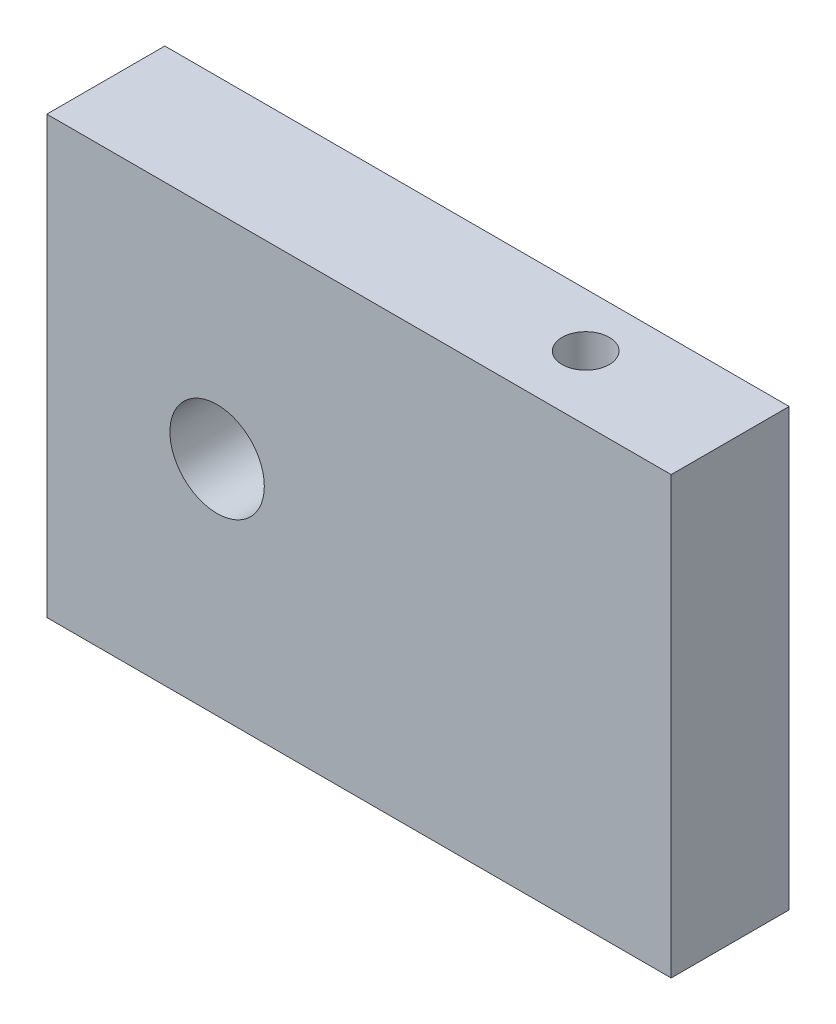
ISO-10303-21;
HEADER;
FILE_DESCRIPTION(('STEP AP214'),'2;1');
FILE_NAME('part.step','',(''),(''),'','','');
FILE_SCHEMA(('AUTOMOTIVE_DESIGN { 1 0 10303 214 1 1 1 1 }'));
ENDSEC;
DATA;
#1=APPLICATION_CONTEXT('core data for automotive mechanical design processes');
#2=APPLICATION_PROTOCOL_DEFINITION('international standard','automotive_design',2000,#1);
#3=PRODUCT_CONTEXT('',#1,'mechanical');
#4=PRODUCT('Part','Part','',(#3));
#5=PRODUCT_RELATED_PRODUCT_CATEGORY('part','',(#4));
#6=PRODUCT_DEFINITION_FORMATION('','',#4);
#7=PRODUCT_DEFINITION_CONTEXT('part definition',#1,'design');
#8=PRODUCT_DEFINITION('design','',#6,#7);
#9=PRODUCT_DEFINITION_SHAPE('','',#8);
#10=(LENGTH_UNIT() NAMED_UNIT(*) SI_UNIT(.MILLI.,.METRE.));
#11=(NAMED_UNIT(*) PLANE_ANGLE_UNIT() SI_UNIT($,.RADIAN.));
#12=(NAMED_UNIT(*) SI_UNIT($,.STERADIAN.) SOLID_ANGLE_UNIT());
#13=UNCERTAINTY_MEASURE_WITH_UNIT(LENGTH_MEASURE(1.E-05),#10,'distance_accuracy_value','');
#14=(GEOMETRIC_REPRESENTATION_CONTEXT(3) GLOBAL_UNCERTAINTY_ASSIGNED_CONTEXT((#13)) GLOBAL_UNIT_ASSIGNED_CONTEXT((#10,
#11,#12)) REPRESENTATION_CONTEXT('',''));
#15=CARTESIAN_POINT('',(0.,0.,0.));
#16=DIRECTION('',(0.,0.,1.));
#17=DIRECTION('',(1.,0.,0.));
#18=AXIS2_PLACEMENT_3D('',#15,#16,#17);
#19=CARTESIAN_POINT('',(66.1380194985695,46.1841977518339,25.));
#20=DIRECTION('',(-1.,0.,0.));
#21=DIRECTION('',(0.,0.,1.));
#22=AXIS2_PLACEMENT_3D('',#19,#20,#21);
#23=PLANE('',#22);
#24=DIRECTION('',(0.,1.,0.));
#25=VECTOR('',#24,1.);
#26=CARTESIAN_POINT('',(66.1380194985695,46.1841977518339,0.));
#27=LINE('',#26,#25);
#28=CARTESIAN_POINT('',(66.1380194985695,-46.1841977518339,0.));
#29=VERTEX_POINT('',#28);
#30=CARTESIAN_POINT('',(66.1380194985695,46.1841977518339,0.));
#31=VERTEX_POINT('',#30);
#32=EDGE_CURVE('E117',#29,#31,#27,.T.);
#33=ORIENTED_EDGE('',*,*,#32,.T.);
#34=DIRECTION('',(0.,0.,-1.));
#35=VECTOR('',#34,1.);
#36=CARTESIAN_POINT('',(66.1380194985695,46.1841977518339,25.));
#37=LINE('',#36,#35);
#38=CARTESIAN_POINT('',(66.1380194985695,46.1841977518339,25.));
#39=VERTEX_POINT('',#38);
#40=EDGE_CURVE('E11',#39,#31,#37,.T.);
#41=ORIENTED_EDGE('',*,*,#40,.F.);
#42=DIRECTION('',(0.,1.,0.));
#43=VECTOR('',#42,1.);
#44=CARTESIAN_POINT('',(66.1380194985695,46.1841977518339,25.));
#45=LINE('',#44,#43);
#46=CARTESIAN_POINT('',(66.1380194985695,-46.1841977518339,25.));
#47=VERTEX_POINT('',#46);
#48=EDGE_CURVE('E101',#47,#39,#45,.T.);
#49=ORIENTED_EDGE('',*,*,#48,.F.);
#50=DIRECTION('',(0.,0.,-1.));
#51=VECTOR('',#50,1.);
#52=CARTESIAN_POINT('',(66.1380194985695,-46.1841977518339,25.));
#53=LINE('',#52,#51);
#54=EDGE_CURVE('E113',#47,#29,#53,.T.);
#55=ORIENTED_EDGE('',*,*,#54,.T.);
#56=EDGE_LOOP('',(#33,#41,#49,#55));
#57=FACE_BOUND('',#56,.T.);
#58=ADVANCED_FACE('F49',(#57),#23,.F.);
#59=CARTESIAN_POINT('',(-66.1380194985695,46.1841977518339,25.));
#60=DIRECTION('',(0.,-1.,0.));
#61=DIRECTION('',(0.,0.,-1.));
#62=AXIS2_PLACEMENT_3D('',#59,#60,#61);
#63=PLANE('',#62);
#64=CARTESIAN_POINT('',(34.3964940046314,46.1841977518339,11.3665911717668));
#65=DIRECTION('',(0.,1.,0.));
#66=DIRECTION('',(0.,0.,1.));
#67=AXIS2_PLACEMENT_3D('',#64,#65,#66);
#68=CIRCLE('',#67,5.);
#69=CARTESIAN_POINT('',(34.3964940046314,46.1841977518339,16.3665911717668));
#70=VERTEX_POINT('',#69);
#71=EDGE_CURVE('E149',#70,#70,#68,.T.);
#72=ORIENTED_EDGE('',*,*,#71,.F.);
#73=EDGE_LOOP('',(#72));
#74=FACE_BOUND('',#73,.T.);
#75=DIRECTION('',(-1.,0.,0.));
#76=VECTOR('',#75,1.);
#77=CARTESIAN_POINT('',(-66.1380194985695,46.1841977518339,0.));
#78=LINE('',#77,#76);
#79=CARTESIAN_POINT('',(-66.1380194985695,46.1841977518339,0.));
#80=VERTEX_POINT('',#79);
#81=EDGE_CURVE('E106',#31,#80,#78,.T.);
#82=ORIENTED_EDGE('',*,*,#81,.T.);
#83=DIRECTION('',(0.,0.,-1.));
#84=VECTOR('',#83,1.);
#85=CARTESIAN_POINT('',(-66.1380194985695,46.1841977518339,25.));
#86=LINE('',#85,#84);
#87=CARTESIAN_POINT('',(-66.1380194985695,46.1841977518339,25.));
#88=VERTEX_POINT('',#87);
#89=EDGE_CURVE('E58',#88,#80,#86,.T.);
#90=ORIENTED_EDGE('',*,*,#89,.F.);
#91=DIRECTION('',(-1.,0.,0.));
#92=VECTOR('',#91,1.);
#93=CARTESIAN_POINT('',(-66.1380194985695,46.1841977518339,25.));
#94=LINE('',#93,#92);
#95=EDGE_CURVE('E96',#39,#88,#94,.T.);
#96=ORIENTED_EDGE('',*,*,#95,.F.);
#97=ORIENTED_EDGE('',*,*,#40,.T.);
#98=EDGE_LOOP('',(#82,#90,#96,#97));
#99=FACE_BOUND('',#98,.T.);
#100=ADVANCED_FACE('F105',(#74,#99),#63,.F.);
#101=CARTESIAN_POINT('',(-66.1380194985695,46.1841977518339,25.));
#102=DIRECTION('',(1.,0.,0.));
#103=DIRECTION('',(0.,0.,-1.));
#104=AXIS2_PLACEMENT_3D('',#101,#102,#103);
#105=PLANE('',#104);
#106=DIRECTION('',(0.,-1.,0.));
#107=VECTOR('',#106,1.);
#108=CARTESIAN_POINT('',(-66.1380194985695,46.1841977518339,0.));
#109=LINE('',#108,#107);
#110=CARTESIAN_POINT('',(-66.1380194985695,-46.1841977518339,0.));
#111=VERTEX_POINT('',#110);
#112=EDGE_CURVE('E83',#80,#111,#109,.T.);
#113=ORIENTED_EDGE('',*,*,#112,.T.);
#114=DIRECTION('',(0.,0.,-1.));
#115=VECTOR('',#114,1.);
#116=CARTESIAN_POINT('',(-66.1380194985695,-46.1841977518339,25.));
#117=LINE('',#116,#115);
#118=CARTESIAN_POINT('',(-66.1380194985695,-46.1841977518339,25.));
#119=VERTEX_POINT('',#118);
#120=EDGE_CURVE('E108',#119,#111,#117,.T.);
#121=ORIENTED_EDGE('',*,*,#120,.F.);
#122=DIRECTION('',(0.,-1.,0.));
#123=VECTOR('',#122,1.);
#124=CARTESIAN_POINT('',(-66.1380194985695,46.1841977518339,25.));
#125=LINE('',#124,#123);
#126=EDGE_CURVE('E99',#88,#119,#125,.T.);
#127=ORIENTED_EDGE('',*,*,#126,.F.);
#128=ORIENTED_EDGE('',*,*,#89,.T.);
#129=EDGE_LOOP('',(#113,#121,#127,#128));
#130=FACE_BOUND('',#129,.T.);
#131=ADVANCED_FACE('F109',(#130),#105,.F.);
#132=CARTESIAN_POINT('',(-66.1380194985695,-46.1841977518339,25.));
#133=DIRECTION('',(0.,1.,0.));
#134=DIRECTION('',(0.,0.,1.));
#135=AXIS2_PLACEMENT_3D('',#132,#133,#134);
#136=PLANE('',#135);
#137=CARTESIAN_POINT('',(34.3964940046314,-46.1841977518339,11.3665911717668));
#138=DIRECTION('',(0.,1.,0.));
#139=DIRECTION('',(0.,0.,1.));
#140=AXIS2_PLACEMENT_3D('',#137,#138,#139);
#141=CIRCLE('',#140,4.99999999999999);
#142=CARTESIAN_POINT('',(34.3964940046314,-46.1841977518339,16.3665911717668));
#143=VERTEX_POINT('',#142);
#144=EDGE_CURVE('E145',#143,#143,#141,.T.);
#145=ORIENTED_EDGE('',*,*,#144,.T.);
#146=EDGE_LOOP('',(#145));
#147=FACE_BOUND('',#146,.T.);
#148=DIRECTION('',(1.,0.,0.));
#149=VECTOR('',#148,1.);
#150=CARTESIAN_POINT('',(-66.1380194985695,-46.1841977518339,0.));
#151=LINE('',#150,#149);
#152=EDGE_CURVE('E89',#111,#29,#151,.T.);
#153=ORIENTED_EDGE('',*,*,#152,.T.);
#154=ORIENTED_EDGE('',*,*,#54,.F.);
#155=DIRECTION('',(1.,0.,0.));
#156=VECTOR('',#155,1.);
#157=CARTESIAN_POINT('',(-66.1380194985695,-46.1841977518339,25.));
#158=LINE('',#157,#156);
#159=EDGE_CURVE('E66',#119,#47,#158,.T.);
#160=ORIENTED_EDGE('',*,*,#159,.F.);
#161=ORIENTED_EDGE('',*,*,#120,.T.);
#162=EDGE_LOOP('',(#153,#154,#160,#161));
#163=FACE_BOUND('',#162,.T.);
#164=ADVANCED_FACE('F131',(#147,#163),#136,.F.);
#165=CARTESIAN_POINT('',(0.,0.,25.));
#166=DIRECTION('',(0.,0.,1.));
#167=DIRECTION('',(1.,0.,0.));
#168=AXIS2_PLACEMENT_3D('',#165,#166,#167);
#169=PLANE('',#168);
#170=CARTESIAN_POINT('',(-30.0599732705231,0.936294249409827,25.));
#171=DIRECTION('',(0.,0.,1.));
#172=DIRECTION('',(1.,0.,0.));
#173=AXIS2_PLACEMENT_3D('',#170,#171,#172);
#174=CIRCLE('',#173,10.);
#175=CARTESIAN_POINT('',(-20.0599732705231,0.936294249409827,25.));
#176=VERTEX_POINT('',#175);
#177=EDGE_CURVE('E141',#176,#176,#174,.T.);
#178=ORIENTED_EDGE('',*,*,#177,.F.);
#179=EDGE_LOOP('',(#178));
#180=FACE_BOUND('',#179,.T.);
#181=ORIENTED_EDGE('',*,*,#48,.T.);
#182=ORIENTED_EDGE('',*,*,#95,.T.);
#183=ORIENTED_EDGE('',*,*,#126,.T.);
#184=ORIENTED_EDGE('',*,*,#159,.T.);
#185=EDGE_LOOP('',(#181,#182,#183,#184));
#186=FACE_BOUND('',#185,.T.);
#187=ADVANCED_FACE('F97',(#180,#186),#169,.T.);
#188=CARTESIAN_POINT('',(0.,0.,0.));
#189=DIRECTION('',(0.,0.,1.));
#190=DIRECTION('',(1.,0.,0.));
#191=AXIS2_PLACEMENT_3D('',#188,#189,#190);
#192=PLANE('',#191);
#193=CARTESIAN_POINT('',(-30.0599732705231,0.936294249409827,0.));
#194=DIRECTION('',(0.,0.,1.));
#195=DIRECTION('',(1.,0.,0.));
#196=AXIS2_PLACEMENT_3D('',#193,#194,#195);
#197=CIRCLE('',#196,10.);
#198=CARTESIAN_POINT('',(-20.0599732705231,0.936294249409827,0.));
#199=VERTEX_POINT('',#198);
#200=EDGE_CURVE('E121',#199,#199,#197,.T.);
#201=ORIENTED_EDGE('',*,*,#200,.T.);
#202=EDGE_LOOP('',(#201));
#203=FACE_BOUND('',#202,.T.);
#204=ORIENTED_EDGE('',*,*,#32,.F.);
#205=ORIENTED_EDGE('',*,*,#152,.F.);
#206=ORIENTED_EDGE('',*,*,#112,.F.);
#207=ORIENTED_EDGE('',*,*,#81,.F.);
#208=EDGE_LOOP('',(#204,#205,#206,#207));
#209=FACE_BOUND('',#208,.T.);
#210=ADVANCED_FACE('F134',(#203,#209),#192,.F.);
#211=CARTESIAN_POINT('',(-30.0599732705231,0.936294249409827,25.));
#212=DIRECTION('',(0.,0.,1.));
#213=DIRECTION('',(1.,0.,0.));
#214=AXIS2_PLACEMENT_3D('',#211,#212,#213);
#215=CYLINDRICAL_SURFACE('',#214,10.);
#216=ORIENTED_EDGE('',*,*,#200,.F.);
#217=EDGE_LOOP('',(#216));
#218=FACE_BOUND('',#217,.T.);
#219=ORIENTED_EDGE('',*,*,#177,.T.);
#220=EDGE_LOOP('',(#219));
#221=FACE_BOUND('',#220,.T.);
#222=ADVANCED_FACE('F169',(#218,#221),#215,.F.);
#223=CARTESIAN_POINT('',(34.3964940046314,46.1841977518339,11.3665911717668));
#224=DIRECTION('',(0.,1.,0.));
#225=DIRECTION('',(0.,0.,1.));
#226=AXIS2_PLACEMENT_3D('',#223,#224,#225);
#227=CYLINDRICAL_SURFACE('',#226,5.);
#228=ORIENTED_EDGE('',*,*,#144,.F.);
#229=EDGE_LOOP('',(#228));
#230=FACE_BOUND('',#229,.T.);
#231=ORIENTED_EDGE('',*,*,#71,.T.);
#232=EDGE_LOOP('',(#231));
#233=FACE_BOUND('',#232,.T.);
#234=ADVANCED_FACE('F154',(#230,#233),#227,.F.);
#235=CLOSED_SHELL('',(#58,#100,#131,#164,#187,#210,#222,#234));
#236=MANIFOLD_SOLID_BREP('B2',#235);
#237=ADVANCED_BREP_SHAPE_REPRESENTATION('',(#18,#236),#14);
#238=SHAPE_DEFINITION_REPRESENTATION(#9,#237);
ENDSEC;
END-ISO-10303-21;
